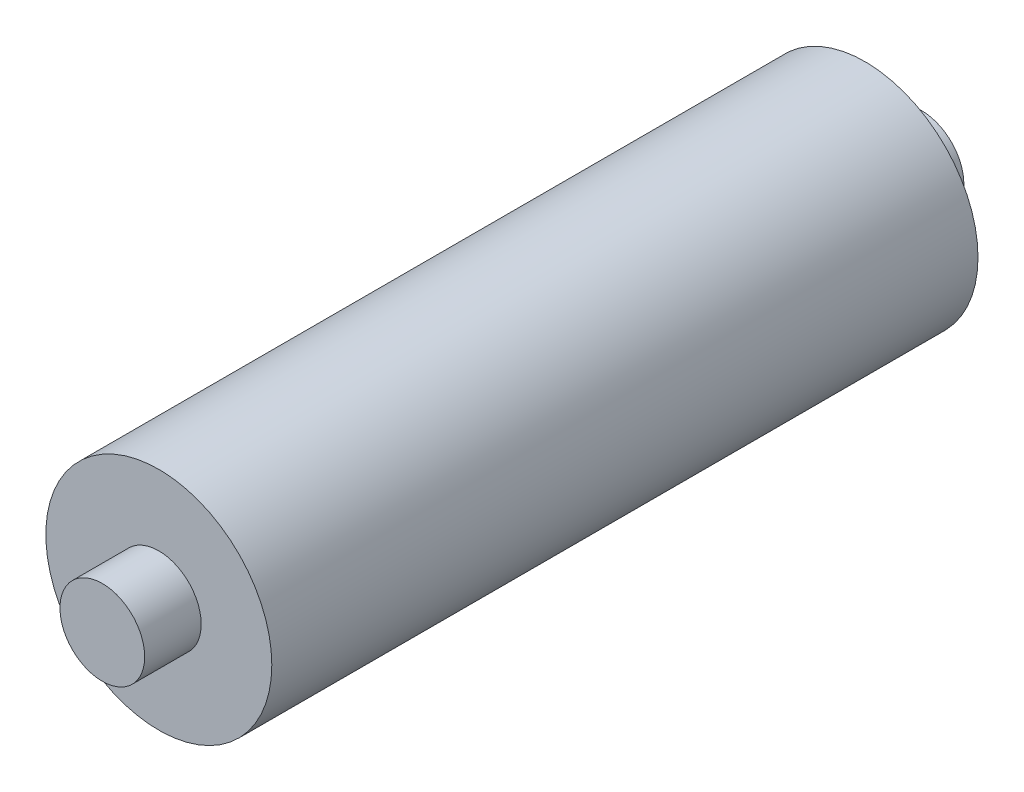
ISO-10303-21;
HEADER;
FILE_DESCRIPTION(('STEP AP214'),'2;1');
FILE_NAME('part.step','',(''),(''),'','','');
FILE_SCHEMA(('AUTOMOTIVE_DESIGN { 1 0 10303 214 1 1 1 1 }'));
ENDSEC;
DATA;
#1=APPLICATION_CONTEXT('core data for automotive mechanical design processes');
#2=APPLICATION_PROTOCOL_DEFINITION('international standard','automotive_design',2000,#1);
#3=PRODUCT_CONTEXT('',#1,'mechanical');
#4=PRODUCT('Part','Part','',(#3));
#5=PRODUCT_RELATED_PRODUCT_CATEGORY('part','',(#4));
#6=PRODUCT_DEFINITION_FORMATION('','',#4);
#7=PRODUCT_DEFINITION_CONTEXT('part definition',#1,'design');
#8=PRODUCT_DEFINITION('design','',#6,#7);
#9=PRODUCT_DEFINITION_SHAPE('','',#8);
#10=(LENGTH_UNIT() NAMED_UNIT(*) SI_UNIT(.MILLI.,.METRE.));
#11=(NAMED_UNIT(*) PLANE_ANGLE_UNIT() SI_UNIT($,.RADIAN.));
#12=(NAMED_UNIT(*) SI_UNIT($,.STERADIAN.) SOLID_ANGLE_UNIT());
#13=UNCERTAINTY_MEASURE_WITH_UNIT(LENGTH_MEASURE(1.E-05),#10,'distance_accuracy_value','');
#14=(GEOMETRIC_REPRESENTATION_CONTEXT(3) GLOBAL_UNCERTAINTY_ASSIGNED_CONTEXT((#13)) GLOBAL_UNIT_ASSIGNED_CONTEXT((#10,
#11,#12)) REPRESENTATION_CONTEXT('',''));
#15=CARTESIAN_POINT('',(0.,0.,0.));
#16=DIRECTION('',(0.,0.,1.));
#17=DIRECTION('',(1.,0.,0.));
#18=AXIS2_PLACEMENT_3D('',#15,#16,#17);
#19=CARTESIAN_POINT('',(0.,0.,250.));
#20=DIRECTION('',(0.,0.,-1.));
#21=DIRECTION('',(-1.,0.,0.));
#22=AXIS2_PLACEMENT_3D('',#19,#20,#21);
#23=CYLINDRICAL_SURFACE('',#22,40.);
#24=CARTESIAN_POINT('',(0.,0.,250.));
#25=DIRECTION('',(0.,0.,1.));
#26=DIRECTION('',(1.,0.,0.));
#27=AXIS2_PLACEMENT_3D('',#24,#25,#26);
#28=CIRCLE('',#27,40.);
#29=CARTESIAN_POINT('',(40.,0.,250.));
#30=VERTEX_POINT('',#29);
#31=EDGE_CURVE('E51',#30,#30,#28,.T.);
#32=ORIENTED_EDGE('',*,*,#31,.F.);
#33=EDGE_LOOP('',(#32));
#34=FACE_BOUND('',#33,.T.);
#35=CARTESIAN_POINT('',(0.,0.,0.));
#36=DIRECTION('',(0.,0.,1.));
#37=DIRECTION('',(1.,0.,0.));
#38=AXIS2_PLACEMENT_3D('',#35,#36,#37);
#39=CIRCLE('',#38,40.);
#40=CARTESIAN_POINT('',(40.,0.,0.));
#41=VERTEX_POINT('',#40);
#42=EDGE_CURVE('E46',#41,#41,#39,.T.);
#43=ORIENTED_EDGE('',*,*,#42,.T.);
#44=EDGE_LOOP('',(#43));
#45=FACE_BOUND('',#44,.T.);
#46=ADVANCED_FACE('F43',(#34,#45),#23,.T.);
#47=CARTESIAN_POINT('',(0.,0.,250.));
#48=DIRECTION('',(0.,0.,1.));
#49=DIRECTION('',(1.,0.,0.));
#50=AXIS2_PLACEMENT_3D('',#47,#48,#49);
#51=PLANE('',#50);
#52=CARTESIAN_POINT('',(0.,0.,250.));
#53=DIRECTION('',(0.,0.,1.));
#54=DIRECTION('',(1.,0.,0.));
#55=AXIS2_PLACEMENT_3D('',#52,#53,#54);
#56=CIRCLE('',#55,15.);
#57=CARTESIAN_POINT('',(15.,0.,250.));
#58=VERTEX_POINT('',#57);
#59=EDGE_CURVE('E10',#58,#58,#56,.T.);
#60=ORIENTED_EDGE('',*,*,#59,.F.);
#61=EDGE_LOOP('',(#60));
#62=FACE_BOUND('',#61,.T.);
#63=ORIENTED_EDGE('',*,*,#31,.T.);
#64=EDGE_LOOP('',(#63));
#65=FACE_BOUND('',#64,.T.);
#66=ADVANCED_FACE('F83',(#62,#65),#51,.T.);
#67=CARTESIAN_POINT('',(0.,0.,0.));
#68=DIRECTION('',(0.,0.,1.));
#69=DIRECTION('',(1.,0.,0.));
#70=AXIS2_PLACEMENT_3D('',#67,#68,#69);
#71=PLANE('',#70);
#72=CARTESIAN_POINT('',(0.,0.,0.));
#73=DIRECTION('',(0.,0.,1.));
#74=DIRECTION('',(1.,0.,0.));
#75=AXIS2_PLACEMENT_3D('',#72,#73,#74);
#76=CIRCLE('',#75,15.);
#77=CARTESIAN_POINT('',(15.,0.,0.));
#78=VERTEX_POINT('',#77);
#79=EDGE_CURVE('E63',#78,#78,#76,.T.);
#80=ORIENTED_EDGE('',*,*,#79,.T.);
#81=EDGE_LOOP('',(#80));
#82=FACE_BOUND('',#81,.T.);
#83=ORIENTED_EDGE('',*,*,#42,.F.);
#84=EDGE_LOOP('',(#83));
#85=FACE_BOUND('',#84,.T.);
#86=ADVANCED_FACE('F88',(#82,#85),#71,.F.);
#87=CARTESIAN_POINT('',(0.,0.,270.));
#88=DIRECTION('',(0.,0.,-1.));
#89=DIRECTION('',(-1.,0.,0.));
#90=AXIS2_PLACEMENT_3D('',#87,#88,#89);
#91=CYLINDRICAL_SURFACE('',#90,15.);
#92=CARTESIAN_POINT('',(0.,0.,270.));
#93=DIRECTION('',(0.,0.,1.));
#94=DIRECTION('',(1.,0.,0.));
#95=AXIS2_PLACEMENT_3D('',#92,#93,#94);
#96=CIRCLE('',#95,15.);
#97=CARTESIAN_POINT('',(15.,0.,270.));
#98=VERTEX_POINT('',#97);
#99=EDGE_CURVE('E58',#98,#98,#96,.T.);
#100=ORIENTED_EDGE('',*,*,#99,.F.);
#101=EDGE_LOOP('',(#100));
#102=FACE_BOUND('',#101,.T.);
#103=ORIENTED_EDGE('',*,*,#59,.T.);
#104=EDGE_LOOP('',(#103));
#105=FACE_BOUND('',#104,.T.);
#106=ADVANCED_FACE('F98',(#102,#105),#91,.T.);
#107=CARTESIAN_POINT('',(0.,0.,270.));
#108=DIRECTION('',(0.,0.,1.));
#109=DIRECTION('',(1.,0.,0.));
#110=AXIS2_PLACEMENT_3D('',#107,#108,#109);
#111=PLANE('',#110);
#112=ORIENTED_EDGE('',*,*,#99,.T.);
#113=EDGE_LOOP('',(#112));
#114=FACE_BOUND('',#113,.T.);
#115=ADVANCED_FACE('F80',(#114),#111,.T.);
#116=CARTESIAN_POINT('',(0.,0.,-20.));
#117=DIRECTION('',(0.,0.,1.));
#118=DIRECTION('',(1.,0.,0.));
#119=AXIS2_PLACEMENT_3D('',#116,#117,#118);
#120=CYLINDRICAL_SURFACE('',#119,15.);
#121=CARTESIAN_POINT('',(0.,0.,-20.));
#122=DIRECTION('',(0.,0.,1.));
#123=DIRECTION('',(1.,0.,0.));
#124=AXIS2_PLACEMENT_3D('',#121,#122,#123);
#125=CIRCLE('',#124,15.);
#126=CARTESIAN_POINT('',(15.,0.,-20.));
#127=VERTEX_POINT('',#126);
#128=EDGE_CURVE('E62',#127,#127,#125,.T.);
#129=ORIENTED_EDGE('',*,*,#128,.T.);
#130=EDGE_LOOP('',(#129));
#131=FACE_BOUND('',#130,.T.);
#132=ORIENTED_EDGE('',*,*,#79,.F.);
#133=EDGE_LOOP('',(#132));
#134=FACE_BOUND('',#133,.T.);
#135=ADVANCED_FACE('F71',(#131,#134),#120,.T.);
#136=CARTESIAN_POINT('',(0.,0.,-20.));
#137=DIRECTION('',(0.,0.,-1.));
#138=DIRECTION('',(1.,0.,0.));
#139=AXIS2_PLACEMENT_3D('',#136,#137,#138);
#140=PLANE('',#139);
#141=ORIENTED_EDGE('',*,*,#128,.F.);
#142=EDGE_LOOP('',(#141));
#143=FACE_BOUND('',#142,.T.);
#144=ADVANCED_FACE('F74',(#143),#140,.T.);
#145=CLOSED_SHELL('',(#46,#66,#86,#106,#115,#135,#144));
#146=MANIFOLD_SOLID_BREP('B2',#145);
#147=ADVANCED_BREP_SHAPE_REPRESENTATION('',(#18,#146),#14);
#148=SHAPE_DEFINITION_REPRESENTATION(#9,#147);
ENDSEC;
END-ISO-10303-21;
